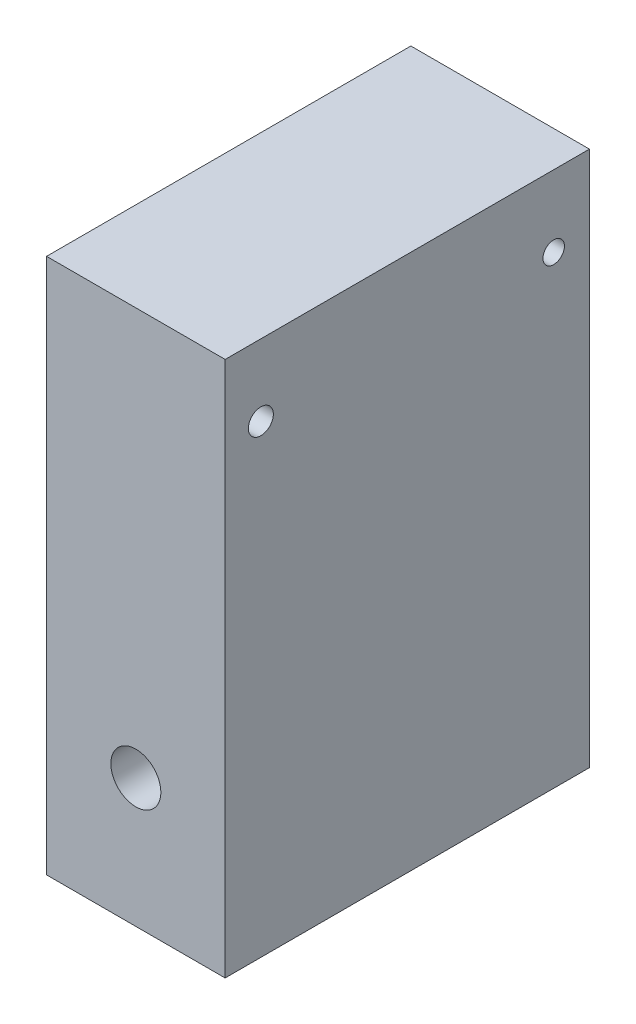
ISO-10303-21;
HEADER;
FILE_DESCRIPTION(('STEP AP214'),'2;1');
FILE_NAME('part.step','',(''),(''),'','','');
FILE_SCHEMA(('AUTOMOTIVE_DESIGN { 1 0 10303 214 1 1 1 1 }'));
ENDSEC;
DATA;
#1=APPLICATION_CONTEXT('core data for automotive mechanical design processes');
#2=APPLICATION_PROTOCOL_DEFINITION('international standard','automotive_design',2000,#1);
#3=PRODUCT_CONTEXT('',#1,'mechanical');
#4=PRODUCT('Part','Part','',(#3));
#5=PRODUCT_RELATED_PRODUCT_CATEGORY('part','',(#4));
#6=PRODUCT_DEFINITION_FORMATION('','',#4);
#7=PRODUCT_DEFINITION_CONTEXT('part definition',#1,'design');
#8=PRODUCT_DEFINITION('design','',#6,#7);
#9=PRODUCT_DEFINITION_SHAPE('','',#8);
#10=(LENGTH_UNIT() NAMED_UNIT(*) SI_UNIT(.MILLI.,.METRE.));
#11=(NAMED_UNIT(*) PLANE_ANGLE_UNIT() SI_UNIT($,.RADIAN.));
#12=(NAMED_UNIT(*) SI_UNIT($,.STERADIAN.) SOLID_ANGLE_UNIT());
#13=UNCERTAINTY_MEASURE_WITH_UNIT(LENGTH_MEASURE(1.E-05),#10,'distance_accuracy_value','');
#14=(GEOMETRIC_REPRESENTATION_CONTEXT(3) GLOBAL_UNCERTAINTY_ASSIGNED_CONTEXT((#13)) GLOBAL_UNIT_ASSIGNED_CONTEXT((#10,
#11,#12)) REPRESENTATION_CONTEXT('',''));
#15=CARTESIAN_POINT('',(0.,0.,0.));
#16=DIRECTION('',(0.,0.,1.));
#17=DIRECTION('',(1.,0.,0.));
#18=AXIS2_PLACEMENT_3D('',#15,#16,#17);
#19=CARTESIAN_POINT('',(5.97500000000001,-51.6097826086957,-19.));
#20=DIRECTION('',(0.,0.,1.));
#21=DIRECTION('',(1.,0.,0.));
#22=AXIS2_PLACEMENT_3D('',#19,#20,#21);
#23=CYLINDRICAL_SURFACE('',#22,3.5);
#24=CARTESIAN_POINT('',(5.97500000000001,-51.6097826086957,5.));
#25=DIRECTION('',(0.,0.,-1.));
#26=DIRECTION('',(-1.,0.,0.));
#27=AXIS2_PLACEMENT_3D('',#24,#25,#26);
#28=CIRCLE('',#27,3.5);
#29=CARTESIAN_POINT('',(2.47500000000001,-51.6097826086957,5.));
#30=VERTEX_POINT('',#29);
#31=EDGE_CURVE('E37',#30,#30,#28,.F.);
#32=ORIENTED_EDGE('',*,*,#31,.T.);
#33=EDGE_LOOP('',(#32));
#34=FACE_BOUND('',#33,.T.);
#35=CARTESIAN_POINT('',(5.97500000000001,-51.6097826086957,0.));
#36=DIRECTION('',(0.,0.,1.));
#37=DIRECTION('',(1.,0.,0.));
#38=AXIS2_PLACEMENT_3D('',#35,#36,#37);
#39=CIRCLE('',#38,3.5);
#40=CARTESIAN_POINT('',(9.47500000000001,-51.6097826086957,0.));
#41=VERTEX_POINT('',#40);
#42=EDGE_CURVE('E156',#41,#41,#39,.T.);
#43=ORIENTED_EDGE('',*,*,#42,.F.);
#44=EDGE_LOOP('',(#43));
#45=FACE_BOUND('',#44,.T.);
#46=ADVANCED_FACE('F33',(#34,#45),#23,.F.);
#47=CARTESIAN_POINT('',(-6.525,5.39021739130435,51.));
#48=DIRECTION('',(1.,0.,0.));
#49=DIRECTION('',(0.,1.,0.));
#50=AXIS2_PLACEMENT_3D('',#47,#48,#49);
#51=PLANE('',#50);
#52=CARTESIAN_POINT('',(-6.525,-4.60978260869566,46.));
#53=DIRECTION('',(1.,0.,0.));
#54=DIRECTION('',(0.,1.,0.));
#55=AXIS2_PLACEMENT_3D('',#52,#53,#54);
#56=CIRCLE('',#55,1.75);
#57=CARTESIAN_POINT('',(-6.525,-2.85978260869565,46.));
#58=VERTEX_POINT('',#57);
#59=EDGE_CURVE('E143',#58,#58,#56,.T.);
#60=ORIENTED_EDGE('',*,*,#59,.T.);
#61=EDGE_LOOP('',(#60));
#62=FACE_BOUND('',#61,.T.);
#63=CARTESIAN_POINT('',(-6.525,-4.60978260869566,5.));
#64=DIRECTION('',(1.,0.,0.));
#65=DIRECTION('',(0.,1.,0.));
#66=AXIS2_PLACEMENT_3D('',#63,#64,#65);
#67=CIRCLE('',#66,1.5);
#68=CARTESIAN_POINT('',(-6.525,-3.10978260869565,5.));
#69=VERTEX_POINT('',#68);
#70=EDGE_CURVE('E326',#69,#69,#67,.T.);
#71=ORIENTED_EDGE('',*,*,#70,.T.);
#72=EDGE_LOOP('',(#71));
#73=FACE_BOUND('',#72,.T.);
#74=DIRECTION('',(0.,-1.,0.));
#75=VECTOR('',#74,1.);
#76=CARTESIAN_POINT('',(-6.525,5.39021739130435,0.));
#77=LINE('',#76,#75);
#78=CARTESIAN_POINT('',(-6.525,5.39021739130435,0.));
#79=VERTEX_POINT('',#78);
#80=CARTESIAN_POINT('',(-6.52499999999999,-69.6097826086957,0.));
#81=VERTEX_POINT('',#80);
#82=EDGE_CURVE('E164',#79,#81,#77,.T.);
#83=ORIENTED_EDGE('',*,*,#82,.T.);
#84=DIRECTION('',(0.,0.,-1.));
#85=VECTOR('',#84,1.);
#86=CARTESIAN_POINT('',(-6.52499999999999,-69.6097826086957,51.));
#87=LINE('',#86,#85);
#88=CARTESIAN_POINT('',(-6.52499999999999,-69.6097826086957,51.));
#89=VERTEX_POINT('',#88);
#90=EDGE_CURVE('E11',#89,#81,#87,.T.);
#91=ORIENTED_EDGE('',*,*,#90,.F.);
#92=DIRECTION('',(0.,-1.,0.));
#93=VECTOR('',#92,1.);
#94=CARTESIAN_POINT('',(-6.525,5.39021739130435,51.));
#95=LINE('',#94,#93);
#96=CARTESIAN_POINT('',(-6.525,5.39021739130435,51.));
#97=VERTEX_POINT('',#96);
#98=EDGE_CURVE('E157',#97,#89,#95,.T.);
#99=ORIENTED_EDGE('',*,*,#98,.F.);
#100=DIRECTION('',(0.,0.,-1.));
#101=VECTOR('',#100,1.);
#102=CARTESIAN_POINT('',(-6.525,5.39021739130435,51.));
#103=LINE('',#102,#101);
#104=EDGE_CURVE('E163',#97,#79,#103,.T.);
#105=ORIENTED_EDGE('',*,*,#104,.T.);
#106=EDGE_LOOP('',(#83,#91,#99,#105));
#107=FACE_BOUND('',#106,.T.);
#108=ADVANCED_FACE('F35',(#62,#73,#107),#51,.F.);
#109=CARTESIAN_POINT('',(-6.52499999999999,-69.6097826086957,51.));
#110=DIRECTION('',(0.,1.,0.));
#111=DIRECTION('',(0.,0.,1.));
#112=AXIS2_PLACEMENT_3D('',#109,#110,#111);
#113=PLANE('',#112);
#114=DIRECTION('',(-1.,0.,0.));
#115=VECTOR('',#114,1.);
#116=CARTESIAN_POINT('',(13.475,-69.6097826086957,46.));
#117=LINE('',#116,#115);
#118=CARTESIAN_POINT('',(13.475,-69.6097826086957,46.));
#119=VERTEX_POINT('',#118);
#120=CARTESIAN_POINT('',(-1.52499999999999,-69.6097826086957,46.));
#121=VERTEX_POINT('',#120);
#122=EDGE_CURVE('E142',#119,#121,#117,.T.);
#123=ORIENTED_EDGE('',*,*,#122,.F.);
#124=DIRECTION('',(0.,0.,1.));
#125=VECTOR('',#124,1.);
#126=CARTESIAN_POINT('',(13.475,-69.6097826086957,5.));
#127=LINE('',#126,#125);
#128=CARTESIAN_POINT('',(13.475,-69.6097826086957,5.));
#129=VERTEX_POINT('',#128);
#130=EDGE_CURVE('E50',#129,#119,#127,.T.);
#131=ORIENTED_EDGE('',*,*,#130,.F.);
#132=DIRECTION('',(1.,0.,0.));
#133=VECTOR('',#132,1.);
#134=CARTESIAN_POINT('',(13.475,-69.6097826086957,5.));
#135=LINE('',#134,#133);
#136=CARTESIAN_POINT('',(-1.52499999999999,-69.6097826086957,5.));
#137=VERTEX_POINT('',#136);
#138=EDGE_CURVE('E130',#137,#129,#135,.T.);
#139=ORIENTED_EDGE('',*,*,#138,.F.);
#140=DIRECTION('',(0.,0.,-1.));
#141=VECTOR('',#140,1.);
#142=CARTESIAN_POINT('',(-1.52499999999999,-69.6097826086957,5.));
#143=LINE('',#142,#141);
#144=EDGE_CURVE('E133',#121,#137,#143,.T.);
#145=ORIENTED_EDGE('',*,*,#144,.F.);
#146=EDGE_LOOP('',(#123,#131,#139,#145));
#147=FACE_BOUND('',#146,.T.);
#148=DIRECTION('',(1.,0.,0.));
#149=VECTOR('',#148,1.);
#150=CARTESIAN_POINT('',(-6.52499999999999,-69.6097826086957,0.));
#151=LINE('',#150,#149);
#152=CARTESIAN_POINT('',(18.475,-69.6097826086957,0.));
#153=VERTEX_POINT('',#152);
#154=EDGE_CURVE('E167',#81,#153,#151,.T.);
#155=ORIENTED_EDGE('',*,*,#154,.T.);
#156=DIRECTION('',(0.,0.,-1.));
#157=VECTOR('',#156,1.);
#158=CARTESIAN_POINT('',(18.475,-69.6097826086957,51.));
#159=LINE('',#158,#157);
#160=CARTESIAN_POINT('',(18.475,-69.6097826086957,51.));
#161=VERTEX_POINT('',#160);
#162=EDGE_CURVE('E42',#161,#153,#159,.T.);
#163=ORIENTED_EDGE('',*,*,#162,.F.);
#164=DIRECTION('',(1.,0.,0.));
#165=VECTOR('',#164,1.);
#166=CARTESIAN_POINT('',(-6.52499999999999,-69.6097826086957,51.));
#167=LINE('',#166,#165);
#168=EDGE_CURVE('E87',#89,#161,#167,.T.);
#169=ORIENTED_EDGE('',*,*,#168,.F.);
#170=ORIENTED_EDGE('',*,*,#90,.T.);
#171=EDGE_LOOP('',(#155,#163,#169,#170));
#172=FACE_BOUND('',#171,.T.);
#173=ADVANCED_FACE('F204',(#147,#172),#113,.F.);
#174=CARTESIAN_POINT('',(18.475,5.39021739130435,51.));
#175=DIRECTION('',(-1.,0.,0.));
#176=DIRECTION('',(0.,-1.,0.));
#177=AXIS2_PLACEMENT_3D('',#174,#175,#176);
#178=PLANE('',#177);
#179=CARTESIAN_POINT('',(18.475,-4.60978260869565,46.));
#180=DIRECTION('',(1.,0.,0.));
#181=DIRECTION('',(0.,1.,0.));
#182=AXIS2_PLACEMENT_3D('',#179,#180,#181);
#183=CIRCLE('',#182,1.75);
#184=CARTESIAN_POINT('',(18.475,-2.85978260869565,46.));
#185=VERTEX_POINT('',#184);
#186=EDGE_CURVE('E325',#185,#185,#183,.T.);
#187=ORIENTED_EDGE('',*,*,#186,.F.);
#188=EDGE_LOOP('',(#187));
#189=FACE_BOUND('',#188,.T.);
#190=CARTESIAN_POINT('',(18.475,-4.60978260869565,5.));
#191=DIRECTION('',(1.,0.,0.));
#192=DIRECTION('',(0.,1.,0.));
#193=AXIS2_PLACEMENT_3D('',#190,#191,#192);
#194=CIRCLE('',#193,1.5);
#195=CARTESIAN_POINT('',(18.475,-3.10978260869565,5.));
#196=VERTEX_POINT('',#195);
#197=EDGE_CURVE('E136',#196,#196,#194,.T.);
#198=ORIENTED_EDGE('',*,*,#197,.F.);
#199=EDGE_LOOP('',(#198));
#200=FACE_BOUND('',#199,.T.);
#201=DIRECTION('',(0.,1.,0.));
#202=VECTOR('',#201,1.);
#203=CARTESIAN_POINT('',(18.475,5.39021739130435,0.));
#204=LINE('',#203,#202);
#205=CARTESIAN_POINT('',(18.475,5.39021739130435,0.));
#206=VERTEX_POINT('',#205);
#207=EDGE_CURVE('E169',#153,#206,#204,.T.);
#208=ORIENTED_EDGE('',*,*,#207,.T.);
#209=DIRECTION('',(0.,0.,-1.));
#210=VECTOR('',#209,1.);
#211=CARTESIAN_POINT('',(18.475,5.39021739130435,51.));
#212=LINE('',#211,#210);
#213=CARTESIAN_POINT('',(18.475,5.39021739130435,51.));
#214=VERTEX_POINT('',#213);
#215=EDGE_CURVE('E173',#214,#206,#212,.T.);
#216=ORIENTED_EDGE('',*,*,#215,.F.);
#217=DIRECTION('',(0.,1.,0.));
#218=VECTOR('',#217,1.);
#219=CARTESIAN_POINT('',(18.475,5.39021739130435,51.));
#220=LINE('',#219,#218);
#221=EDGE_CURVE('E160',#161,#214,#220,.T.);
#222=ORIENTED_EDGE('',*,*,#221,.F.);
#223=ORIENTED_EDGE('',*,*,#162,.T.);
#224=EDGE_LOOP('',(#208,#216,#222,#223));
#225=FACE_BOUND('',#224,.T.);
#226=ADVANCED_FACE('F218',(#189,#200,#225),#178,.F.);
#227=CARTESIAN_POINT('',(-6.525,5.39021739130435,51.));
#228=DIRECTION('',(0.,-1.,0.));
#229=DIRECTION('',(0.,0.,-1.));
#230=AXIS2_PLACEMENT_3D('',#227,#228,#229);
#231=PLANE('',#230);
#232=DIRECTION('',(-1.,0.,0.));
#233=VECTOR('',#232,1.);
#234=CARTESIAN_POINT('',(-6.525,5.39021739130435,0.));
#235=LINE('',#234,#233);
#236=EDGE_CURVE('E80',#206,#79,#235,.T.);
#237=ORIENTED_EDGE('',*,*,#236,.T.);
#238=ORIENTED_EDGE('',*,*,#104,.F.);
#239=DIRECTION('',(-1.,0.,0.));
#240=VECTOR('',#239,1.);
#241=CARTESIAN_POINT('',(-6.525,5.39021739130435,51.));
#242=LINE('',#241,#240);
#243=EDGE_CURVE('E59',#214,#97,#242,.T.);
#244=ORIENTED_EDGE('',*,*,#243,.F.);
#245=ORIENTED_EDGE('',*,*,#215,.T.);
#246=EDGE_LOOP('',(#237,#238,#244,#245));
#247=FACE_BOUND('',#246,.T.);
#248=ADVANCED_FACE('F211',(#247),#231,.F.);
#249=CARTESIAN_POINT('',(0.,0.,51.));
#250=DIRECTION('',(0.,0.,1.));
#251=DIRECTION('',(1.,0.,0.));
#252=AXIS2_PLACEMENT_3D('',#249,#250,#251);
#253=PLANE('',#252);
#254=CARTESIAN_POINT('',(5.97500000000001,-51.6097826086957,51.));
#255=DIRECTION('',(0.,0.,1.));
#256=DIRECTION('',(1.,0.,0.));
#257=AXIS2_PLACEMENT_3D('',#254,#255,#256);
#258=CIRCLE('',#257,3.5);
#259=CARTESIAN_POINT('',(9.47500000000001,-51.6097826086957,51.));
#260=VERTEX_POINT('',#259);
#261=EDGE_CURVE('E153',#260,#260,#258,.T.);
#262=ORIENTED_EDGE('',*,*,#261,.F.);
#263=EDGE_LOOP('',(#262));
#264=FACE_BOUND('',#263,.T.);
#265=ORIENTED_EDGE('',*,*,#98,.T.);
#266=ORIENTED_EDGE('',*,*,#168,.T.);
#267=ORIENTED_EDGE('',*,*,#221,.T.);
#268=ORIENTED_EDGE('',*,*,#243,.T.);
#269=EDGE_LOOP('',(#265,#266,#267,#268));
#270=FACE_BOUND('',#269,.T.);
#271=ADVANCED_FACE('F208',(#264,#270),#253,.T.);
#272=CARTESIAN_POINT('',(0.,0.,0.));
#273=DIRECTION('',(0.,0.,1.));
#274=DIRECTION('',(1.,0.,0.));
#275=AXIS2_PLACEMENT_3D('',#272,#273,#274);
#276=PLANE('',#275);
#277=ORIENTED_EDGE('',*,*,#42,.T.);
#278=EDGE_LOOP('',(#277));
#279=FACE_BOUND('',#278,.T.);
#280=ORIENTED_EDGE('',*,*,#82,.F.);
#281=ORIENTED_EDGE('',*,*,#236,.F.);
#282=ORIENTED_EDGE('',*,*,#207,.F.);
#283=ORIENTED_EDGE('',*,*,#154,.F.);
#284=EDGE_LOOP('',(#280,#281,#282,#283));
#285=FACE_BOUND('',#284,.T.);
#286=ADVANCED_FACE('F196',(#279,#285),#276,.F.);
#287=CARTESIAN_POINT('',(5.97500000000001,-51.6097826086957,46.));
#288=DIRECTION('',(0.,0.,1.));
#289=DIRECTION('',(1.,0.,0.));
#290=AXIS2_PLACEMENT_3D('',#287,#288,#289);
#291=CIRCLE('',#290,3.5);
#292=CARTESIAN_POINT('',(9.47500000000001,-51.6097826086957,46.));
#293=VERTEX_POINT('',#292);
#294=EDGE_CURVE('E149',#293,#293,#291,.F.);
#295=ORIENTED_EDGE('',*,*,#294,.T.);
#296=EDGE_LOOP('',(#295));
#297=FACE_BOUND('',#296,.T.);
#298=ORIENTED_EDGE('',*,*,#261,.T.);
#299=EDGE_LOOP('',(#298));
#300=FACE_BOUND('',#299,.T.);
#301=ADVANCED_FACE('F188',(#297,#300),#23,.F.);
#302=CARTESIAN_POINT('',(13.475,-40.6097826086957,5.));
#303=DIRECTION('',(0.,0.,-1.));
#304=DIRECTION('',(-1.,0.,0.));
#305=AXIS2_PLACEMENT_3D('',#302,#303,#304);
#306=PLANE('',#305);
#307=ORIENTED_EDGE('',*,*,#138,.T.);
#308=DIRECTION('',(0.,-1.,0.));
#309=VECTOR('',#308,1.);
#310=CARTESIAN_POINT('',(13.475,-40.6097826086957,5.));
#311=LINE('',#310,#309);
#312=CARTESIAN_POINT('',(13.475,-40.6097826086957,5.));
#313=VERTEX_POINT('',#312);
#314=EDGE_CURVE('E147',#313,#129,#311,.T.);
#315=ORIENTED_EDGE('',*,*,#314,.F.);
#316=DIRECTION('',(1.,0.,0.));
#317=VECTOR('',#316,1.);
#318=CARTESIAN_POINT('',(13.475,-40.6097826086957,5.));
#319=LINE('',#318,#317);
#320=CARTESIAN_POINT('',(-1.52499999999999,-40.6097826086957,5.));
#321=VERTEX_POINT('',#320);
#322=EDGE_CURVE('E117',#321,#313,#319,.T.);
#323=ORIENTED_EDGE('',*,*,#322,.F.);
#324=DIRECTION('',(0.,-1.,0.));
#325=VECTOR('',#324,1.);
#326=CARTESIAN_POINT('',(-1.52499999999999,-40.6097826086957,5.));
#327=LINE('',#326,#325);
#328=EDGE_CURVE('E150',#321,#137,#327,.T.);
#329=ORIENTED_EDGE('',*,*,#328,.T.);
#330=EDGE_LOOP('',(#307,#315,#323,#329));
#331=FACE_BOUND('',#330,.T.);
#332=ORIENTED_EDGE('',*,*,#31,.F.);
#333=EDGE_LOOP('',(#332));
#334=FACE_BOUND('',#333,.T.);
#335=ADVANCED_FACE('F186',(#331,#334),#306,.F.);
#336=CARTESIAN_POINT('',(13.475,-40.6097826086957,46.));
#337=DIRECTION('',(0.,0.,1.));
#338=DIRECTION('',(1.,0.,0.));
#339=AXIS2_PLACEMENT_3D('',#336,#337,#338);
#340=PLANE('',#339);
#341=ORIENTED_EDGE('',*,*,#122,.T.);
#342=DIRECTION('',(0.,-1.,0.));
#343=VECTOR('',#342,1.);
#344=CARTESIAN_POINT('',(-1.52499999999999,-40.6097826086957,46.));
#345=LINE('',#344,#343);
#346=CARTESIAN_POINT('',(-1.52499999999999,-40.6097826086957,46.));
#347=VERTEX_POINT('',#346);
#348=EDGE_CURVE('E116',#347,#121,#345,.T.);
#349=ORIENTED_EDGE('',*,*,#348,.F.);
#350=DIRECTION('',(-1.,0.,0.));
#351=VECTOR('',#350,1.);
#352=CARTESIAN_POINT('',(13.475,-40.6097826086957,46.));
#353=LINE('',#352,#351);
#354=CARTESIAN_POINT('',(13.475,-40.6097826086957,46.));
#355=VERTEX_POINT('',#354);
#356=EDGE_CURVE('E120',#355,#347,#353,.T.);
#357=ORIENTED_EDGE('',*,*,#356,.F.);
#358=DIRECTION('',(0.,-1.,0.));
#359=VECTOR('',#358,1.);
#360=CARTESIAN_POINT('',(13.475,-40.6097826086957,46.));
#361=LINE('',#360,#359);
#362=EDGE_CURVE('E107',#355,#119,#361,.T.);
#363=ORIENTED_EDGE('',*,*,#362,.T.);
#364=EDGE_LOOP('',(#341,#349,#357,#363));
#365=FACE_BOUND('',#364,.T.);
#366=ORIENTED_EDGE('',*,*,#294,.F.);
#367=EDGE_LOOP('',(#366));
#368=FACE_BOUND('',#367,.T.);
#369=ADVANCED_FACE('F121',(#365,#368),#340,.F.);
#370=CARTESIAN_POINT('',(13.475,-40.6097826086957,5.));
#371=DIRECTION('',(1.,0.,0.));
#372=DIRECTION('',(0.,0.,-1.));
#373=AXIS2_PLACEMENT_3D('',#370,#371,#372);
#374=PLANE('',#373);
#375=ORIENTED_EDGE('',*,*,#130,.T.);
#376=ORIENTED_EDGE('',*,*,#362,.F.);
#377=DIRECTION('',(0.,0.,1.));
#378=VECTOR('',#377,1.);
#379=CARTESIAN_POINT('',(13.475,-40.6097826086957,5.));
#380=LINE('',#379,#378);
#381=EDGE_CURVE('E111',#313,#355,#380,.T.);
#382=ORIENTED_EDGE('',*,*,#381,.F.);
#383=ORIENTED_EDGE('',*,*,#314,.T.);
#384=EDGE_LOOP('',(#375,#376,#382,#383));
#385=FACE_BOUND('',#384,.T.);
#386=ADVANCED_FACE('F109',(#385),#374,.F.);
#387=CARTESIAN_POINT('',(-1.52499999999999,-40.6097826086957,5.));
#388=DIRECTION('',(-1.,0.,0.));
#389=DIRECTION('',(0.,0.,1.));
#390=AXIS2_PLACEMENT_3D('',#387,#388,#389);
#391=PLANE('',#390);
#392=ORIENTED_EDGE('',*,*,#144,.T.);
#393=ORIENTED_EDGE('',*,*,#328,.F.);
#394=DIRECTION('',(0.,0.,-1.));
#395=VECTOR('',#394,1.);
#396=CARTESIAN_POINT('',(-1.52499999999999,-40.6097826086957,5.));
#397=LINE('',#396,#395);
#398=EDGE_CURVE('E126',#347,#321,#397,.T.);
#399=ORIENTED_EDGE('',*,*,#398,.F.);
#400=ORIENTED_EDGE('',*,*,#348,.T.);
#401=EDGE_LOOP('',(#392,#393,#399,#400));
#402=FACE_BOUND('',#401,.T.);
#403=ADVANCED_FACE('F237',(#402),#391,.F.);
#404=CARTESIAN_POINT('',(0.,-40.6097826086957,0.));
#405=DIRECTION('',(0.,-1.,0.));
#406=DIRECTION('',(0.,0.,-1.));
#407=AXIS2_PLACEMENT_3D('',#404,#405,#406);
#408=PLANE('',#407);
#409=ORIENTED_EDGE('',*,*,#381,.T.);
#410=ORIENTED_EDGE('',*,*,#356,.T.);
#411=ORIENTED_EDGE('',*,*,#398,.T.);
#412=ORIENTED_EDGE('',*,*,#322,.T.);
#413=EDGE_LOOP('',(#409,#410,#411,#412));
#414=FACE_BOUND('',#413,.T.);
#415=ADVANCED_FACE('F128',(#414),#408,.T.);
#416=CARTESIAN_POINT('',(-6.525,-4.60978260869566,5.));
#417=DIRECTION('',(1.,0.,0.));
#418=DIRECTION('',(0.,1.,0.));
#419=AXIS2_PLACEMENT_3D('',#416,#417,#418);
#420=CYLINDRICAL_SURFACE('',#419,1.5);
#421=ORIENTED_EDGE('',*,*,#70,.F.);
#422=EDGE_LOOP('',(#421));
#423=FACE_BOUND('',#422,.T.);
#424=ORIENTED_EDGE('',*,*,#197,.T.);
#425=EDGE_LOOP('',(#424));
#426=FACE_BOUND('',#425,.T.);
#427=ADVANCED_FACE('F243',(#423,#426),#420,.F.);
#428=CARTESIAN_POINT('',(-6.525,-4.60978260869566,46.));
#429=DIRECTION('',(1.,0.,0.));
#430=DIRECTION('',(0.,1.,0.));
#431=AXIS2_PLACEMENT_3D('',#428,#429,#430);
#432=CYLINDRICAL_SURFACE('',#431,1.75);
#433=ORIENTED_EDGE('',*,*,#59,.F.);
#434=EDGE_LOOP('',(#433));
#435=FACE_BOUND('',#434,.T.);
#436=ORIENTED_EDGE('',*,*,#186,.T.);
#437=EDGE_LOOP('',(#436));
#438=FACE_BOUND('',#437,.T.);
#439=ADVANCED_FACE('F305',(#435,#438),#432,.F.);
#440=CLOSED_SHELL('',(#46,#108,#173,#226,#248,#271,#286,#301,#335,#369,#386,#403,#415,#427,#439));
#441=MANIFOLD_SOLID_BREP('B2',#440);
#442=ADVANCED_BREP_SHAPE_REPRESENTATION('',(#18,#441),#14);
#443=SHAPE_DEFINITION_REPRESENTATION(#9,#442);
ENDSEC;
END-ISO-10303-21;
